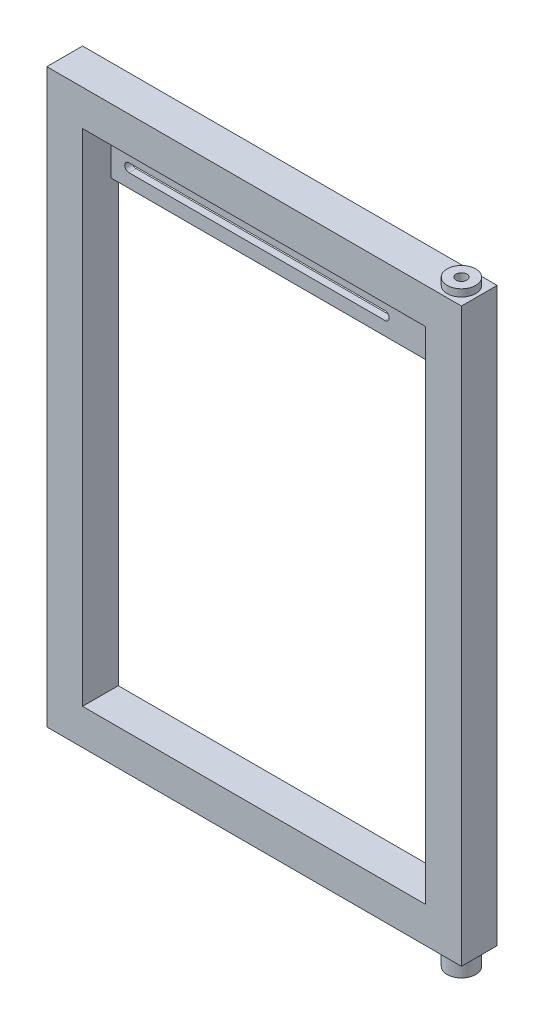
ISO-10303-21;
HEADER;
FILE_DESCRIPTION(('STEP AP214'),'2;1');
FILE_NAME('part.step','',(''),(''),'','','');
FILE_SCHEMA(('AUTOMOTIVE_DESIGN { 1 0 10303 214 1 1 1 1 }'));
ENDSEC;
DATA;
#1=APPLICATION_CONTEXT('core data for automotive mechanical design processes');
#2=APPLICATION_PROTOCOL_DEFINITION('international standard','automotive_design',2000,#1);
#3=PRODUCT_CONTEXT('',#1,'mechanical');
#4=PRODUCT('Part','Part','',(#3));
#5=PRODUCT_RELATED_PRODUCT_CATEGORY('part','',(#4));
#6=PRODUCT_DEFINITION_FORMATION('','',#4);
#7=PRODUCT_DEFINITION_CONTEXT('part definition',#1,'design');
#8=PRODUCT_DEFINITION('design','',#6,#7);
#9=PRODUCT_DEFINITION_SHAPE('','',#8);
#10=(LENGTH_UNIT() NAMED_UNIT(*) SI_UNIT(.MILLI.,.METRE.));
#11=(NAMED_UNIT(*) PLANE_ANGLE_UNIT() SI_UNIT($,.RADIAN.));
#12=(NAMED_UNIT(*) SI_UNIT($,.STERADIAN.) SOLID_ANGLE_UNIT());
#13=UNCERTAINTY_MEASURE_WITH_UNIT(LENGTH_MEASURE(1.E-05),#10,'distance_accuracy_value','');
#14=(GEOMETRIC_REPRESENTATION_CONTEXT(3) GLOBAL_UNCERTAINTY_ASSIGNED_CONTEXT((#13)) GLOBAL_UNIT_ASSIGNED_CONTEXT((#10,
#11,#12)) REPRESENTATION_CONTEXT('',''));
#15=CARTESIAN_POINT('',(0.,0.,0.));
#16=DIRECTION('',(0.,0.,1.));
#17=DIRECTION('',(1.,0.,0.));
#18=AXIS2_PLACEMENT_3D('',#15,#16,#17);
#19=CARTESIAN_POINT('',(0.,0.,50.));
#20=DIRECTION('',(0.,1.,0.));
#21=DIRECTION('',(0.,0.,1.));
#22=AXIS2_PLACEMENT_3D('',#19,#20,#21);
#23=PLANE('',#22);
#24=DIRECTION('',(1.,0.,0.));
#25=VECTOR('',#24,1.);
#26=CARTESIAN_POINT('',(0.,0.,0.));
#27=LINE('',#26,#25);
#28=CARTESIAN_POINT('',(0.,0.,0.));
#29=VERTEX_POINT('',#28);
#30=CARTESIAN_POINT('',(580.,0.,0.));
#31=VERTEX_POINT('',#30);
#32=EDGE_CURVE('E209',#29,#31,#27,.T.);
#33=ORIENTED_EDGE('',*,*,#32,.T.);
#34=DIRECTION('',(0.,0.,-1.));
#35=VECTOR('',#34,1.);
#36=CARTESIAN_POINT('',(580.,0.,50.));
#37=LINE('',#36,#35);
#38=CARTESIAN_POINT('',(580.,0.,50.));
#39=VERTEX_POINT('',#38);
#40=EDGE_CURVE('E228',#39,#31,#37,.T.);
#41=ORIENTED_EDGE('',*,*,#40,.F.);
#42=DIRECTION('',(1.,0.,0.));
#43=VECTOR('',#42,1.);
#44=CARTESIAN_POINT('',(0.,0.,50.));
#45=LINE('',#44,#43);
#46=CARTESIAN_POINT('',(0.,0.,50.));
#47=VERTEX_POINT('',#46);
#48=EDGE_CURVE('E217',#47,#39,#45,.T.);
#49=ORIENTED_EDGE('',*,*,#48,.F.);
#50=DIRECTION('',(0.,0.,-1.));
#51=VECTOR('',#50,1.);
#52=CARTESIAN_POINT('',(0.,0.,50.));
#53=LINE('',#52,#51);
#54=EDGE_CURVE('E231',#47,#29,#53,.T.);
#55=ORIENTED_EDGE('',*,*,#54,.T.);
#56=EDGE_LOOP('',(#33,#41,#49,#55));
#57=FACE_BOUND('',#56,.T.);
#58=CARTESIAN_POINT('',(555.,0.,25.));
#59=DIRECTION('',(0.,1.,0.));
#60=DIRECTION('',(0.,0.,1.));
#61=AXIS2_PLACEMENT_3D('',#58,#59,#60);
#62=CIRCLE('',#61,20.);
#63=CARTESIAN_POINT('',(555.,0.,45.));
#64=VERTEX_POINT('',#63);
#65=EDGE_CURVE('E11',#64,#64,#62,.F.);
#66=ORIENTED_EDGE('',*,*,#65,.F.);
#67=EDGE_LOOP('',(#66));
#68=FACE_BOUND('',#67,.T.);
#69=ADVANCED_FACE('F16',(#57,#68),#23,.F.);
#70=CARTESIAN_POINT('',(0.,800.,50.));
#71=DIRECTION('',(0.,-1.,0.));
#72=DIRECTION('',(0.,0.,-1.));
#73=AXIS2_PLACEMENT_3D('',#70,#71,#72);
#74=PLANE('',#73);
#75=DIRECTION('',(-1.,0.,0.));
#76=VECTOR('',#75,1.);
#77=CARTESIAN_POINT('',(0.,800.,0.));
#78=LINE('',#77,#76);
#79=CARTESIAN_POINT('',(580.,800.,0.));
#80=VERTEX_POINT('',#79);
#81=CARTESIAN_POINT('',(0.,800.,0.));
#82=VERTEX_POINT('',#81);
#83=EDGE_CURVE('E213',#80,#82,#78,.T.);
#84=ORIENTED_EDGE('',*,*,#83,.T.);
#85=DIRECTION('',(0.,0.,-1.));
#86=VECTOR('',#85,1.);
#87=CARTESIAN_POINT('',(0.,800.,50.));
#88=LINE('',#87,#86);
#89=CARTESIAN_POINT('',(0.,800.,50.));
#90=VERTEX_POINT('',#89);
#91=EDGE_CURVE('E222',#90,#82,#88,.T.);
#92=ORIENTED_EDGE('',*,*,#91,.F.);
#93=DIRECTION('',(-1.,0.,0.));
#94=VECTOR('',#93,1.);
#95=CARTESIAN_POINT('',(0.,800.,50.));
#96=LINE('',#95,#94);
#97=CARTESIAN_POINT('',(580.,800.,50.));
#98=VERTEX_POINT('',#97);
#99=EDGE_CURVE('E39',#98,#90,#96,.T.);
#100=ORIENTED_EDGE('',*,*,#99,.F.);
#101=DIRECTION('',(0.,0.,-1.));
#102=VECTOR('',#101,1.);
#103=CARTESIAN_POINT('',(580.,800.,50.));
#104=LINE('',#103,#102);
#105=EDGE_CURVE('E225',#98,#80,#104,.T.);
#106=ORIENTED_EDGE('',*,*,#105,.T.);
#107=EDGE_LOOP('',(#84,#92,#100,#106));
#108=FACE_BOUND('',#107,.T.);
#109=CARTESIAN_POINT('',(555.,800.,25.));
#110=DIRECTION('',(0.,-1.,0.));
#111=DIRECTION('',(0.,0.,-1.));
#112=AXIS2_PLACEMENT_3D('',#109,#110,#111);
#113=CIRCLE('',#112,20.);
#114=CARTESIAN_POINT('',(555.,800.,5.));
#115=VERTEX_POINT('',#114);
#116=EDGE_CURVE('E24',#115,#115,#113,.F.);
#117=ORIENTED_EDGE('',*,*,#116,.F.);
#118=EDGE_LOOP('',(#117));
#119=FACE_BOUND('',#118,.T.);
#120=ADVANCED_FACE('F238',(#108,#119),#74,.F.);
#121=CARTESIAN_POINT('',(50.,50.,50.));
#122=DIRECTION('',(1.,0.,0.));
#123=DIRECTION('',(0.,0.,-1.));
#124=AXIS2_PLACEMENT_3D('',#121,#122,#123);
#125=PLANE('',#124);
#126=DIRECTION('',(0.,0.,-1.));
#127=VECTOR('',#126,1.);
#128=CARTESIAN_POINT('',(50.,670.,10.));
#129=LINE('',#128,#127);
#130=CARTESIAN_POINT('',(50.,670.,10.));
#131=VERTEX_POINT('',#130);
#132=CARTESIAN_POINT('',(50.,670.,0.));
#133=VERTEX_POINT('',#132);
#134=EDGE_CURVE('E179',#131,#133,#129,.T.);
#135=ORIENTED_EDGE('',*,*,#134,.F.);
#136=DIRECTION('',(0.,-1.,0.));
#137=VECTOR('',#136,1.);
#138=CARTESIAN_POINT('',(50.,750.,10.));
#139=LINE('',#138,#137);
#140=CARTESIAN_POINT('',(50.,750.,10.));
#141=VERTEX_POINT('',#140);
#142=EDGE_CURVE('E172',#141,#131,#139,.T.);
#143=ORIENTED_EDGE('',*,*,#142,.F.);
#144=DIRECTION('',(0.,0.,-1.));
#145=VECTOR('',#144,1.);
#146=CARTESIAN_POINT('',(50.,750.,50.));
#147=LINE('',#146,#145);
#148=CARTESIAN_POINT('',(50.,750.,50.));
#149=VERTEX_POINT('',#148);
#150=EDGE_CURVE('E197',#149,#141,#147,.T.);
#151=ORIENTED_EDGE('',*,*,#150,.F.);
#152=DIRECTION('',(0.,-1.,0.));
#153=VECTOR('',#152,1.);
#154=CARTESIAN_POINT('',(50.,50.,50.));
#155=LINE('',#154,#153);
#156=CARTESIAN_POINT('',(50.,50.,50.));
#157=VERTEX_POINT('',#156);
#158=EDGE_CURVE('E189',#149,#157,#155,.T.);
#159=ORIENTED_EDGE('',*,*,#158,.T.);
#160=DIRECTION('',(0.,0.,-1.));
#161=VECTOR('',#160,1.);
#162=CARTESIAN_POINT('',(50.,50.,50.));
#163=LINE('',#162,#161);
#164=CARTESIAN_POINT('',(50.,50.,0.));
#165=VERTEX_POINT('',#164);
#166=EDGE_CURVE('E203',#157,#165,#163,.T.);
#167=ORIENTED_EDGE('',*,*,#166,.T.);
#168=DIRECTION('',(0.,-1.,0.));
#169=VECTOR('',#168,1.);
#170=CARTESIAN_POINT('',(50.,50.,0.));
#171=LINE('',#170,#169);
#172=EDGE_CURVE('E181',#133,#165,#171,.T.);
#173=ORIENTED_EDGE('',*,*,#172,.F.);
#174=EDGE_LOOP('',(#135,#143,#151,#159,#167,#173));
#175=FACE_BOUND('',#174,.T.);
#176=ADVANCED_FACE('F240',(#175),#125,.T.);
#177=CARTESIAN_POINT('',(530.,50.,50.));
#178=DIRECTION('',(-1.,0.,0.));
#179=DIRECTION('',(0.,0.,1.));
#180=AXIS2_PLACEMENT_3D('',#177,#178,#179);
#181=PLANE('',#180);
#182=DIRECTION('',(0.,0.,-1.));
#183=VECTOR('',#182,1.);
#184=CARTESIAN_POINT('',(530.,750.,50.));
#185=LINE('',#184,#183);
#186=CARTESIAN_POINT('',(530.,750.,50.));
#187=VERTEX_POINT('',#186);
#188=CARTESIAN_POINT('',(530.,750.,10.));
#189=VERTEX_POINT('',#188);
#190=EDGE_CURVE('E31',#187,#189,#185,.T.);
#191=ORIENTED_EDGE('',*,*,#190,.T.);
#192=DIRECTION('',(0.,1.,0.));
#193=VECTOR('',#192,1.);
#194=CARTESIAN_POINT('',(530.,750.,10.));
#195=LINE('',#194,#193);
#196=CARTESIAN_POINT('',(530.,670.,10.));
#197=VERTEX_POINT('',#196);
#198=EDGE_CURVE('E168',#197,#189,#195,.T.);
#199=ORIENTED_EDGE('',*,*,#198,.F.);
#200=DIRECTION('',(0.,0.,-1.));
#201=VECTOR('',#200,1.);
#202=CARTESIAN_POINT('',(530.,670.,10.));
#203=LINE('',#202,#201);
#204=CARTESIAN_POINT('',(530.,670.,0.));
#205=VERTEX_POINT('',#204);
#206=EDGE_CURVE('E176',#197,#205,#203,.T.);
#207=ORIENTED_EDGE('',*,*,#206,.T.);
#208=DIRECTION('',(0.,1.,0.));
#209=VECTOR('',#208,1.);
#210=CARTESIAN_POINT('',(530.,50.,0.));
#211=LINE('',#210,#209);
#212=CARTESIAN_POINT('',(530.,50.,0.));
#213=VERTEX_POINT('',#212);
#214=EDGE_CURVE('E186',#213,#205,#211,.T.);
#215=ORIENTED_EDGE('',*,*,#214,.F.);
#216=DIRECTION('',(0.,0.,-1.));
#217=VECTOR('',#216,1.);
#218=CARTESIAN_POINT('',(530.,50.,50.));
#219=LINE('',#218,#217);
#220=CARTESIAN_POINT('',(530.,50.,50.));
#221=VERTEX_POINT('',#220);
#222=EDGE_CURVE('E201',#221,#213,#219,.T.);
#223=ORIENTED_EDGE('',*,*,#222,.F.);
#224=DIRECTION('',(0.,1.,0.));
#225=VECTOR('',#224,1.);
#226=CARTESIAN_POINT('',(530.,50.,50.));
#227=LINE('',#226,#225);
#228=EDGE_CURVE('E193',#221,#187,#227,.T.);
#229=ORIENTED_EDGE('',*,*,#228,.T.);
#230=EDGE_LOOP('',(#191,#199,#207,#215,#223,#229));
#231=FACE_BOUND('',#230,.T.);
#232=ADVANCED_FACE('F248',(#231),#181,.T.);
#233=CARTESIAN_POINT('',(50.,750.,50.));
#234=DIRECTION('',(0.,-1.,0.));
#235=DIRECTION('',(0.,0.,-1.));
#236=AXIS2_PLACEMENT_3D('',#233,#234,#235);
#237=PLANE('',#236);
#238=ORIENTED_EDGE('',*,*,#150,.T.);
#239=DIRECTION('',(-1.,0.,0.));
#240=VECTOR('',#239,1.);
#241=CARTESIAN_POINT('',(530.,750.,10.));
#242=LINE('',#241,#240);
#243=EDGE_CURVE('E170',#189,#141,#242,.T.);
#244=ORIENTED_EDGE('',*,*,#243,.F.);
#245=ORIENTED_EDGE('',*,*,#190,.F.);
#246=DIRECTION('',(-1.,0.,0.));
#247=VECTOR('',#246,1.);
#248=CARTESIAN_POINT('',(50.,750.,50.));
#249=LINE('',#248,#247);
#250=EDGE_CURVE('E195',#187,#149,#249,.T.);
#251=ORIENTED_EDGE('',*,*,#250,.T.);
#252=EDGE_LOOP('',(#238,#244,#245,#251));
#253=FACE_BOUND('',#252,.T.);
#254=ADVANCED_FACE('F321',(#253),#237,.T.);
#255=CARTESIAN_POINT('',(0.,800.,50.));
#256=DIRECTION('',(0.,0.,-1.));
#257=DIRECTION('',(-1.,0.,0.));
#258=AXIS2_PLACEMENT_3D('',#255,#256,#257);
#259=PLANE('',#258);
#260=DIRECTION('',(0.,-1.,0.));
#261=VECTOR('',#260,1.);
#262=CARTESIAN_POINT('',(0.,0.,50.));
#263=LINE('',#262,#261);
#264=EDGE_CURVE('E215',#90,#47,#263,.T.);
#265=ORIENTED_EDGE('',*,*,#264,.T.);
#266=ORIENTED_EDGE('',*,*,#48,.T.);
#267=DIRECTION('',(0.,1.,0.));
#268=VECTOR('',#267,1.);
#269=CARTESIAN_POINT('',(580.,0.,50.));
#270=LINE('',#269,#268);
#271=EDGE_CURVE('E219',#39,#98,#270,.T.);
#272=ORIENTED_EDGE('',*,*,#271,.T.);
#273=ORIENTED_EDGE('',*,*,#99,.T.);
#274=EDGE_LOOP('',(#265,#266,#272,#273));
#275=FACE_BOUND('',#274,.T.);
#276=ORIENTED_EDGE('',*,*,#158,.F.);
#277=ORIENTED_EDGE('',*,*,#250,.F.);
#278=ORIENTED_EDGE('',*,*,#228,.F.);
#279=DIRECTION('',(1.,0.,0.));
#280=VECTOR('',#279,1.);
#281=CARTESIAN_POINT('',(50.,50.,50.));
#282=LINE('',#281,#280);
#283=EDGE_CURVE('E191',#157,#221,#282,.T.);
#284=ORIENTED_EDGE('',*,*,#283,.F.);
#285=EDGE_LOOP('',(#276,#277,#278,#284));
#286=FACE_BOUND('',#285,.T.);
#287=ADVANCED_FACE('F254',(#275,#286),#259,.F.);
#288=CARTESIAN_POINT('',(0.,800.,0.));
#289=DIRECTION('',(0.,0.,-1.));
#290=DIRECTION('',(-1.,0.,0.));
#291=AXIS2_PLACEMENT_3D('',#288,#289,#290);
#292=PLANE('',#291);
#293=DIRECTION('',(1.,0.,0.));
#294=VECTOR('',#293,1.);
#295=CARTESIAN_POINT('',(530.,670.,0.));
#296=LINE('',#295,#294);
#297=EDGE_CURVE('E139',#133,#205,#296,.T.);
#298=ORIENTED_EDGE('',*,*,#297,.F.);
#299=ORIENTED_EDGE('',*,*,#172,.T.);
#300=DIRECTION('',(1.,0.,0.));
#301=VECTOR('',#300,1.);
#302=CARTESIAN_POINT('',(50.,50.,0.));
#303=LINE('',#302,#301);
#304=EDGE_CURVE('E183',#165,#213,#303,.T.);
#305=ORIENTED_EDGE('',*,*,#304,.T.);
#306=ORIENTED_EDGE('',*,*,#214,.T.);
#307=EDGE_LOOP('',(#298,#299,#305,#306));
#308=FACE_BOUND('',#307,.T.);
#309=DIRECTION('',(0.,-1.,0.));
#310=VECTOR('',#309,1.);
#311=CARTESIAN_POINT('',(0.,0.,0.));
#312=LINE('',#311,#310);
#313=EDGE_CURVE('E206',#82,#29,#312,.T.);
#314=ORIENTED_EDGE('',*,*,#313,.F.);
#315=ORIENTED_EDGE('',*,*,#83,.F.);
#316=DIRECTION('',(0.,1.,0.));
#317=VECTOR('',#316,1.);
#318=CARTESIAN_POINT('',(580.,0.,0.));
#319=LINE('',#318,#317);
#320=EDGE_CURVE('E211',#31,#80,#319,.T.);
#321=ORIENTED_EDGE('',*,*,#320,.F.);
#322=ORIENTED_EDGE('',*,*,#32,.F.);
#323=EDGE_LOOP('',(#314,#315,#321,#322));
#324=FACE_BOUND('',#323,.T.);
#325=DIRECTION('',(-1.,0.,0.));
#326=VECTOR('',#325,1.);
#327=CARTESIAN_POINT('',(75.,701.,0.));
#328=LINE('',#327,#326);
#329=CARTESIAN_POINT('',(433.,701.,0.));
#330=VERTEX_POINT('',#329);
#331=CARTESIAN_POINT('',(75.,701.,0.));
#332=VERTEX_POINT('',#331);
#333=EDGE_CURVE('E144',#330,#332,#328,.T.);
#334=ORIENTED_EDGE('',*,*,#333,.T.);
#335=CARTESIAN_POINT('',(75.,695.,0.));
#336=DIRECTION('',(0.,0.,1.));
#337=DIRECTION('',(1.,0.,0.));
#338=AXIS2_PLACEMENT_3D('',#335,#336,#337);
#339=CIRCLE('',#338,6.);
#340=CARTESIAN_POINT('',(75.,689.,0.));
#341=VERTEX_POINT('',#340);
#342=EDGE_CURVE('E131',#332,#341,#339,.T.);
#343=ORIENTED_EDGE('',*,*,#342,.T.);
#344=DIRECTION('',(1.,0.,0.));
#345=VECTOR('',#344,1.);
#346=CARTESIAN_POINT('',(75.,689.,0.));
#347=LINE('',#346,#345);
#348=CARTESIAN_POINT('',(433.,689.,0.));
#349=VERTEX_POINT('',#348);
#350=EDGE_CURVE('E119',#341,#349,#347,.T.);
#351=ORIENTED_EDGE('',*,*,#350,.T.);
#352=CARTESIAN_POINT('',(433.,695.,0.));
#353=DIRECTION('',(0.,0.,1.));
#354=DIRECTION('',(1.,0.,0.));
#355=AXIS2_PLACEMENT_3D('',#352,#353,#354);
#356=CIRCLE('',#355,6.);
#357=EDGE_CURVE('E130',#349,#330,#356,.T.);
#358=ORIENTED_EDGE('',*,*,#357,.T.);
#359=EDGE_LOOP('',(#334,#343,#351,#358));
#360=FACE_BOUND('',#359,.T.);
#361=ADVANCED_FACE('F142',(#308,#324,#360),#292,.T.);
#362=CARTESIAN_POINT('',(0.,0.,50.));
#363=DIRECTION('',(1.,0.,0.));
#364=DIRECTION('',(0.,0.,-1.));
#365=AXIS2_PLACEMENT_3D('',#362,#363,#364);
#366=PLANE('',#365);
#367=ORIENTED_EDGE('',*,*,#313,.T.);
#368=ORIENTED_EDGE('',*,*,#54,.F.);
#369=ORIENTED_EDGE('',*,*,#264,.F.);
#370=ORIENTED_EDGE('',*,*,#91,.T.);
#371=EDGE_LOOP('',(#367,#368,#369,#370));
#372=FACE_BOUND('',#371,.T.);
#373=ADVANCED_FACE('F18',(#372),#366,.F.);
#374=CARTESIAN_POINT('',(580.,0.,50.));
#375=DIRECTION('',(-1.,0.,0.));
#376=DIRECTION('',(0.,0.,1.));
#377=AXIS2_PLACEMENT_3D('',#374,#375,#376);
#378=PLANE('',#377);
#379=ORIENTED_EDGE('',*,*,#320,.T.);
#380=ORIENTED_EDGE('',*,*,#105,.F.);
#381=ORIENTED_EDGE('',*,*,#271,.F.);
#382=ORIENTED_EDGE('',*,*,#40,.T.);
#383=EDGE_LOOP('',(#379,#380,#381,#382));
#384=FACE_BOUND('',#383,.T.);
#385=ADVANCED_FACE('F256',(#384),#378,.F.);
#386=CARTESIAN_POINT('',(50.,50.,50.));
#387=DIRECTION('',(0.,1.,0.));
#388=DIRECTION('',(0.,0.,1.));
#389=AXIS2_PLACEMENT_3D('',#386,#387,#388);
#390=PLANE('',#389);
#391=ORIENTED_EDGE('',*,*,#304,.F.);
#392=ORIENTED_EDGE('',*,*,#166,.F.);
#393=ORIENTED_EDGE('',*,*,#283,.T.);
#394=ORIENTED_EDGE('',*,*,#222,.T.);
#395=EDGE_LOOP('',(#391,#392,#393,#394));
#396=FACE_BOUND('',#395,.T.);
#397=ADVANCED_FACE('F258',(#396),#390,.T.);
#398=CARTESIAN_POINT('',(530.,750.,10.));
#399=DIRECTION('',(0.,0.,-1.));
#400=DIRECTION('',(-1.,0.,0.));
#401=AXIS2_PLACEMENT_3D('',#398,#399,#400);
#402=PLANE('',#401);
#403=ORIENTED_EDGE('',*,*,#198,.T.);
#404=ORIENTED_EDGE('',*,*,#243,.T.);
#405=ORIENTED_EDGE('',*,*,#142,.T.);
#406=DIRECTION('',(1.,0.,0.));
#407=VECTOR('',#406,1.);
#408=CARTESIAN_POINT('',(530.,670.,10.));
#409=LINE('',#408,#407);
#410=EDGE_CURVE('E174',#131,#197,#409,.T.);
#411=ORIENTED_EDGE('',*,*,#410,.T.);
#412=EDGE_LOOP('',(#403,#404,#405,#411));
#413=FACE_BOUND('',#412,.T.);
#414=CARTESIAN_POINT('',(75.,695.,10.));
#415=DIRECTION('',(0.,0.,1.));
#416=DIRECTION('',(1.,0.,0.));
#417=AXIS2_PLACEMENT_3D('',#414,#415,#416);
#418=CIRCLE('',#417,6.);
#419=CARTESIAN_POINT('',(75.,701.,10.));
#420=VERTEX_POINT('',#419);
#421=CARTESIAN_POINT('',(75.,689.,10.));
#422=VERTEX_POINT('',#421);
#423=EDGE_CURVE('E138',#420,#422,#418,.T.);
#424=ORIENTED_EDGE('',*,*,#423,.F.);
#425=DIRECTION('',(-1.,0.,0.));
#426=VECTOR('',#425,1.);
#427=CARTESIAN_POINT('',(75.,701.,10.));
#428=LINE('',#427,#426);
#429=CARTESIAN_POINT('',(433.,701.,10.));
#430=VERTEX_POINT('',#429);
#431=EDGE_CURVE('E160',#430,#420,#428,.T.);
#432=ORIENTED_EDGE('',*,*,#431,.F.);
#433=CARTESIAN_POINT('',(433.,695.,10.));
#434=DIRECTION('',(0.,0.,1.));
#435=DIRECTION('',(1.,0.,0.));
#436=AXIS2_PLACEMENT_3D('',#433,#434,#435);
#437=CIRCLE('',#436,6.);
#438=CARTESIAN_POINT('',(433.,689.,10.));
#439=VERTEX_POINT('',#438);
#440=EDGE_CURVE('E157',#439,#430,#437,.T.);
#441=ORIENTED_EDGE('',*,*,#440,.F.);
#442=DIRECTION('',(1.,0.,0.));
#443=VECTOR('',#442,1.);
#444=CARTESIAN_POINT('',(75.,689.,10.));
#445=LINE('',#444,#443);
#446=EDGE_CURVE('E155',#422,#439,#445,.T.);
#447=ORIENTED_EDGE('',*,*,#446,.F.);
#448=EDGE_LOOP('',(#424,#432,#441,#447));
#449=FACE_BOUND('',#448,.T.);
#450=ADVANCED_FACE('F264',(#413,#449),#402,.F.);
#451=CARTESIAN_POINT('',(530.,670.,10.));
#452=DIRECTION('',(0.,1.,0.));
#453=DIRECTION('',(-1.,0.,0.));
#454=AXIS2_PLACEMENT_3D('',#451,#452,#453);
#455=PLANE('',#454);
#456=ORIENTED_EDGE('',*,*,#297,.T.);
#457=ORIENTED_EDGE('',*,*,#206,.F.);
#458=ORIENTED_EDGE('',*,*,#410,.F.);
#459=ORIENTED_EDGE('',*,*,#134,.T.);
#460=EDGE_LOOP('',(#456,#457,#458,#459));
#461=FACE_BOUND('',#460,.T.);
#462=ADVANCED_FACE('F314',(#461),#455,.F.);
#463=CARTESIAN_POINT('',(75.,695.,10.));
#464=DIRECTION('',(0.,0.,-1.));
#465=DIRECTION('',(-1.,0.,0.));
#466=AXIS2_PLACEMENT_3D('',#463,#464,#465);
#467=CYLINDRICAL_SURFACE('',#466,6.);
#468=ORIENTED_EDGE('',*,*,#342,.F.);
#469=DIRECTION('',(0.,0.,-1.));
#470=VECTOR('',#469,1.);
#471=CARTESIAN_POINT('',(75.,701.,10.));
#472=LINE('',#471,#470);
#473=EDGE_CURVE('E162',#420,#332,#472,.T.);
#474=ORIENTED_EDGE('',*,*,#473,.F.);
#475=ORIENTED_EDGE('',*,*,#423,.T.);
#476=DIRECTION('',(0.,0.,-1.));
#477=VECTOR('',#476,1.);
#478=CARTESIAN_POINT('',(75.,689.,10.));
#479=LINE('',#478,#477);
#480=EDGE_CURVE('E122',#422,#341,#479,.T.);
#481=ORIENTED_EDGE('',*,*,#480,.T.);
#482=EDGE_LOOP('',(#468,#474,#475,#481));
#483=FACE_BOUND('',#482,.T.);
#484=ADVANCED_FACE('F134',(#483),#467,.F.);
#485=CARTESIAN_POINT('',(75.,689.,10.));
#486=DIRECTION('',(0.,1.,0.));
#487=DIRECTION('',(0.,0.,1.));
#488=AXIS2_PLACEMENT_3D('',#485,#486,#487);
#489=PLANE('',#488);
#490=ORIENTED_EDGE('',*,*,#350,.F.);
#491=ORIENTED_EDGE('',*,*,#480,.F.);
#492=ORIENTED_EDGE('',*,*,#446,.T.);
#493=DIRECTION('',(0.,0.,-1.));
#494=VECTOR('',#493,1.);
#495=CARTESIAN_POINT('',(433.,689.,10.));
#496=LINE('',#495,#494);
#497=EDGE_CURVE('E125',#439,#349,#496,.T.);
#498=ORIENTED_EDGE('',*,*,#497,.T.);
#499=EDGE_LOOP('',(#490,#491,#492,#498));
#500=FACE_BOUND('',#499,.T.);
#501=ADVANCED_FACE('F121',(#500),#489,.T.);
#502=CARTESIAN_POINT('',(433.,695.,10.));
#503=DIRECTION('',(0.,0.,-1.));
#504=DIRECTION('',(-1.,0.,0.));
#505=AXIS2_PLACEMENT_3D('',#502,#503,#504);
#506=CYLINDRICAL_SURFACE('',#505,6.);
#507=ORIENTED_EDGE('',*,*,#357,.F.);
#508=ORIENTED_EDGE('',*,*,#497,.F.);
#509=ORIENTED_EDGE('',*,*,#440,.T.);
#510=DIRECTION('',(0.,0.,-1.));
#511=VECTOR('',#510,1.);
#512=CARTESIAN_POINT('',(433.,701.,10.));
#513=LINE('',#512,#511);
#514=EDGE_CURVE('E164',#430,#330,#513,.T.);
#515=ORIENTED_EDGE('',*,*,#514,.T.);
#516=EDGE_LOOP('',(#507,#508,#509,#515));
#517=FACE_BOUND('',#516,.T.);
#518=ADVANCED_FACE('F305',(#517),#506,.F.);
#519=CARTESIAN_POINT('',(75.,701.,10.));
#520=DIRECTION('',(0.,-1.,0.));
#521=DIRECTION('',(0.,0.,-1.));
#522=AXIS2_PLACEMENT_3D('',#519,#520,#521);
#523=PLANE('',#522);
#524=ORIENTED_EDGE('',*,*,#333,.F.);
#525=ORIENTED_EDGE('',*,*,#514,.F.);
#526=ORIENTED_EDGE('',*,*,#431,.T.);
#527=ORIENTED_EDGE('',*,*,#473,.T.);
#528=EDGE_LOOP('',(#524,#525,#526,#527));
#529=FACE_BOUND('',#528,.T.);
#530=ADVANCED_FACE('F301',(#529),#523,.T.);
#531=CARTESIAN_POINT('',(555.,810.,25.));
#532=DIRECTION('',(0.,-1.,0.));
#533=DIRECTION('',(0.,0.,-1.));
#534=AXIS2_PLACEMENT_3D('',#531,#532,#533);
#535=CYLINDRICAL_SURFACE('',#534,20.);
#536=CARTESIAN_POINT('',(555.,810.,25.));
#537=DIRECTION('',(0.,1.,0.));
#538=DIRECTION('',(0.,0.,1.));
#539=AXIS2_PLACEMENT_3D('',#536,#537,#538);
#540=CIRCLE('',#539,20.);
#541=CARTESIAN_POINT('',(555.,810.,45.));
#542=VERTEX_POINT('',#541);
#543=EDGE_CURVE('E145',#542,#542,#540,.T.);
#544=ORIENTED_EDGE('',*,*,#543,.F.);
#545=EDGE_LOOP('',(#544));
#546=FACE_BOUND('',#545,.T.);
#547=ORIENTED_EDGE('',*,*,#116,.T.);
#548=EDGE_LOOP('',(#547));
#549=FACE_BOUND('',#548,.T.);
#550=ADVANCED_FACE('F236',(#546,#549),#535,.T.);
#551=CARTESIAN_POINT('',(555.,810.,25.));
#552=DIRECTION('',(0.,1.,0.));
#553=DIRECTION('',(0.,0.,1.));
#554=AXIS2_PLACEMENT_3D('',#551,#552,#553);
#555=PLANE('',#554);
#556=CARTESIAN_POINT('',(555.,810.,25.));
#557=DIRECTION('',(0.,1.,0.));
#558=DIRECTION('',(0.,0.,1.));
#559=AXIS2_PLACEMENT_3D('',#556,#557,#558);
#560=CIRCLE('',#559,7.5);
#561=CARTESIAN_POINT('',(555.,810.,32.5));
#562=VERTEX_POINT('',#561);
#563=EDGE_CURVE('E498',#562,#562,#560,.T.);
#564=ORIENTED_EDGE('',*,*,#563,.F.);
#565=EDGE_LOOP('',(#564));
#566=FACE_BOUND('',#565,.T.);
#567=ORIENTED_EDGE('',*,*,#543,.T.);
#568=EDGE_LOOP('',(#567));
#569=FACE_BOUND('',#568,.T.);
#570=ADVANCED_FACE('F284',(#566,#569),#555,.T.);
#571=CARTESIAN_POINT('',(555.,-25.,25.));
#572=DIRECTION('',(0.,1.,0.));
#573=DIRECTION('',(0.,0.,1.));
#574=AXIS2_PLACEMENT_3D('',#571,#572,#573);
#575=CYLINDRICAL_SURFACE('',#574,20.);
#576=CARTESIAN_POINT('',(555.,-25.,25.));
#577=DIRECTION('',(0.,-1.,0.));
#578=DIRECTION('',(0.,0.,-1.));
#579=AXIS2_PLACEMENT_3D('',#576,#577,#578);
#580=CIRCLE('',#579,20.);
#581=CARTESIAN_POINT('',(555.,-25.,5.));
#582=VERTEX_POINT('',#581);
#583=EDGE_CURVE('E148',#582,#582,#580,.T.);
#584=ORIENTED_EDGE('',*,*,#583,.F.);
#585=EDGE_LOOP('',(#584));
#586=FACE_BOUND('',#585,.T.);
#587=ORIENTED_EDGE('',*,*,#65,.T.);
#588=EDGE_LOOP('',(#587));
#589=FACE_BOUND('',#588,.T.);
#590=ADVANCED_FACE('F281',(#586,#589),#575,.T.);
#591=CARTESIAN_POINT('',(555.,-25.,25.));
#592=DIRECTION('',(0.,-1.,0.));
#593=DIRECTION('',(0.,0.,-1.));
#594=AXIS2_PLACEMENT_3D('',#591,#592,#593);
#595=PLANE('',#594);
#596=CARTESIAN_POINT('',(555.,-25.,25.));
#597=DIRECTION('',(0.,1.,0.));
#598=DIRECTION('',(0.,0.,1.));
#599=AXIS2_PLACEMENT_3D('',#596,#597,#598);
#600=CIRCLE('',#599,7.5);
#601=CARTESIAN_POINT('',(555.,-25.,32.5));
#602=VERTEX_POINT('',#601);
#603=EDGE_CURVE('E495',#602,#602,#600,.T.);
#604=ORIENTED_EDGE('',*,*,#603,.T.);
#605=EDGE_LOOP('',(#604));
#606=FACE_BOUND('',#605,.T.);
#607=ORIENTED_EDGE('',*,*,#583,.T.);
#608=EDGE_LOOP('',(#607));
#609=FACE_BOUND('',#608,.T.);
#610=ADVANCED_FACE('F283',(#606,#609),#595,.T.);
#611=CARTESIAN_POINT('',(555.,-25.,25.));
#612=DIRECTION('',(0.,1.,0.));
#613=DIRECTION('',(0.,0.,1.));
#614=AXIS2_PLACEMENT_3D('',#611,#612,#613);
#615=CYLINDRICAL_SURFACE('',#614,7.5);
#616=ORIENTED_EDGE('',*,*,#603,.F.);
#617=EDGE_LOOP('',(#616));
#618=FACE_BOUND('',#617,.T.);
#619=ORIENTED_EDGE('',*,*,#563,.T.);
#620=EDGE_LOOP('',(#619));
#621=FACE_BOUND('',#620,.T.);
#622=ADVANCED_FACE('F291',(#618,#621),#615,.F.);
#623=CLOSED_SHELL('',(#69,#120,#176,#232,#254,#287,#361,#373,#385,#397,#450,#462,#484,#501,#518,
#530,#550,#570,#590,#610,#622));
#624=MANIFOLD_SOLID_BREP('B1',#623);
#625=ADVANCED_BREP_SHAPE_REPRESENTATION('',(#18,#624),#14);
#626=SHAPE_DEFINITION_REPRESENTATION(#9,#625);
ENDSEC;
END-ISO-10303-21;
